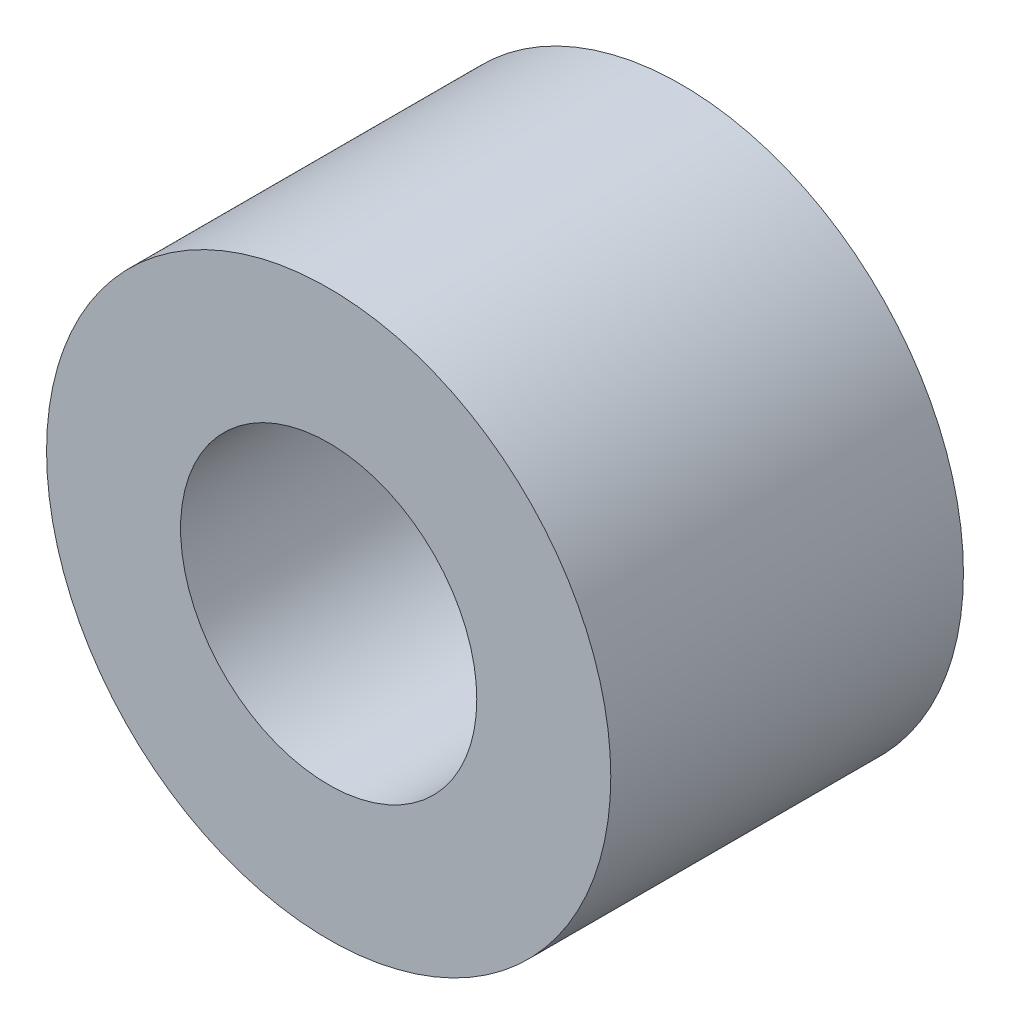
ISO-10303-21;
HEADER;
FILE_DESCRIPTION(('STEP AP214'),'2;1');
FILE_NAME('part.step','',(''),(''),'','','');
FILE_SCHEMA(('AUTOMOTIVE_DESIGN { 1 0 10303 214 1 1 1 1 }'));
ENDSEC;
DATA;
#1=APPLICATION_CONTEXT('core data for automotive mechanical design processes');
#2=APPLICATION_PROTOCOL_DEFINITION('international standard','automotive_design',2000,#1);
#3=PRODUCT_CONTEXT('',#1,'mechanical');
#4=PRODUCT('Part','Part','',(#3));
#5=PRODUCT_RELATED_PRODUCT_CATEGORY('part','',(#4));
#6=PRODUCT_DEFINITION_FORMATION('','',#4);
#7=PRODUCT_DEFINITION_CONTEXT('part definition',#1,'design');
#8=PRODUCT_DEFINITION('design','',#6,#7);
#9=PRODUCT_DEFINITION_SHAPE('','',#8);
#10=(LENGTH_UNIT() NAMED_UNIT(*) SI_UNIT(.MILLI.,.METRE.));
#11=(NAMED_UNIT(*) PLANE_ANGLE_UNIT() SI_UNIT($,.RADIAN.));
#12=(NAMED_UNIT(*) SI_UNIT($,.STERADIAN.) SOLID_ANGLE_UNIT());
#13=UNCERTAINTY_MEASURE_WITH_UNIT(LENGTH_MEASURE(1.E-05),#10,'distance_accuracy_value','');
#14=(GEOMETRIC_REPRESENTATION_CONTEXT(3) GLOBAL_UNCERTAINTY_ASSIGNED_CONTEXT((#13)) GLOBAL_UNIT_ASSIGNED_CONTEXT((#10,
#11,#12)) REPRESENTATION_CONTEXT('',''));
#15=CARTESIAN_POINT('',(0.,0.,0.));
#16=DIRECTION('',(0.,0.,1.));
#17=DIRECTION('',(1.,0.,0.));
#18=AXIS2_PLACEMENT_3D('',#15,#16,#17);
#19=CARTESIAN_POINT('',(0.,0.,-5.));
#20=DIRECTION('',(0.,0.,-1.));
#21=DIRECTION('',(1.,0.,0.));
#22=AXIS2_PLACEMENT_3D('',#19,#20,#21);
#23=PLANE('',#22);
#24=CARTESIAN_POINT('',(0.,0.,-5.));
#25=DIRECTION('',(0.,0.,1.));
#26=DIRECTION('',(1.,0.,0.));
#27=AXIS2_PLACEMENT_3D('',#24,#25,#26);
#28=CIRCLE('',#27,4.);
#29=CARTESIAN_POINT('',(4.,0.,-5.));
#30=VERTEX_POINT('',#29);
#31=EDGE_CURVE('E10',#30,#30,#28,.T.);
#32=ORIENTED_EDGE('',*,*,#31,.F.);
#33=EDGE_LOOP('',(#32));
#34=FACE_BOUND('',#33,.T.);
#35=CARTESIAN_POINT('',(0.,0.,-5.));
#36=DIRECTION('',(0.,0.,1.));
#37=DIRECTION('',(1.,0.,0.));
#38=AXIS2_PLACEMENT_3D('',#35,#36,#37);
#39=CIRCLE('',#38,2.1);
#40=CARTESIAN_POINT('',(2.1,0.,-5.));
#41=VERTEX_POINT('',#40);
#42=EDGE_CURVE('E46',#41,#41,#39,.T.);
#43=ORIENTED_EDGE('',*,*,#42,.T.);
#44=EDGE_LOOP('',(#43));
#45=FACE_BOUND('',#44,.T.);
#46=ADVANCED_FACE('F35',(#34,#45),#23,.T.);
#47=CARTESIAN_POINT('',(0.,0.,0.));
#48=DIRECTION('',(0.,0.,-1.));
#49=DIRECTION('',(1.,0.,0.));
#50=AXIS2_PLACEMENT_3D('',#47,#48,#49);
#51=PLANE('',#50);
#52=CARTESIAN_POINT('',(0.,0.,0.));
#53=DIRECTION('',(0.,0.,1.));
#54=DIRECTION('',(1.,0.,0.));
#55=AXIS2_PLACEMENT_3D('',#52,#53,#54);
#56=CIRCLE('',#55,4.);
#57=CARTESIAN_POINT('',(4.,0.,0.));
#58=VERTEX_POINT('',#57);
#59=EDGE_CURVE('E39',#58,#58,#56,.T.);
#60=ORIENTED_EDGE('',*,*,#59,.T.);
#61=EDGE_LOOP('',(#60));
#62=FACE_BOUND('',#61,.T.);
#63=CARTESIAN_POINT('',(0.,0.,0.));
#64=DIRECTION('',(0.,0.,1.));
#65=DIRECTION('',(1.,0.,0.));
#66=AXIS2_PLACEMENT_3D('',#63,#64,#65);
#67=CIRCLE('',#66,2.1);
#68=CARTESIAN_POINT('',(2.1,0.,0.));
#69=VERTEX_POINT('',#68);
#70=EDGE_CURVE('E48',#69,#69,#67,.T.);
#71=ORIENTED_EDGE('',*,*,#70,.F.);
#72=EDGE_LOOP('',(#71));
#73=FACE_BOUND('',#72,.T.);
#74=ADVANCED_FACE('F61',(#62,#73),#51,.F.);
#75=CARTESIAN_POINT('',(0.,0.,-5.));
#76=DIRECTION('',(0.,0.,1.));
#77=DIRECTION('',(-1.,0.,0.));
#78=AXIS2_PLACEMENT_3D('',#75,#76,#77);
#79=CYLINDRICAL_SURFACE('',#78,4.);
#80=ORIENTED_EDGE('',*,*,#31,.T.);
#81=EDGE_LOOP('',(#80));
#82=FACE_BOUND('',#81,.T.);
#83=ORIENTED_EDGE('',*,*,#59,.F.);
#84=EDGE_LOOP('',(#83));
#85=FACE_BOUND('',#84,.T.);
#86=ADVANCED_FACE('F37',(#82,#85),#79,.T.);
#87=CARTESIAN_POINT('',(0.,0.,-5.));
#88=DIRECTION('',(0.,0.,1.));
#89=DIRECTION('',(-1.,0.,0.));
#90=AXIS2_PLACEMENT_3D('',#87,#88,#89);
#91=CYLINDRICAL_SURFACE('',#90,2.1);
#92=ORIENTED_EDGE('',*,*,#42,.F.);
#93=EDGE_LOOP('',(#92));
#94=FACE_BOUND('',#93,.T.);
#95=ORIENTED_EDGE('',*,*,#70,.T.);
#96=EDGE_LOOP('',(#95));
#97=FACE_BOUND('',#96,.T.);
#98=ADVANCED_FACE('F55',(#94,#97),#91,.F.);
#99=CLOSED_SHELL('',(#46,#74,#86,#98));
#100=MANIFOLD_SOLID_BREP('B2',#99);
#101=ADVANCED_BREP_SHAPE_REPRESENTATION('',(#18,#100),#14);
#102=SHAPE_DEFINITION_REPRESENTATION(#9,#101);
ENDSEC;
END-ISO-10303-21;
